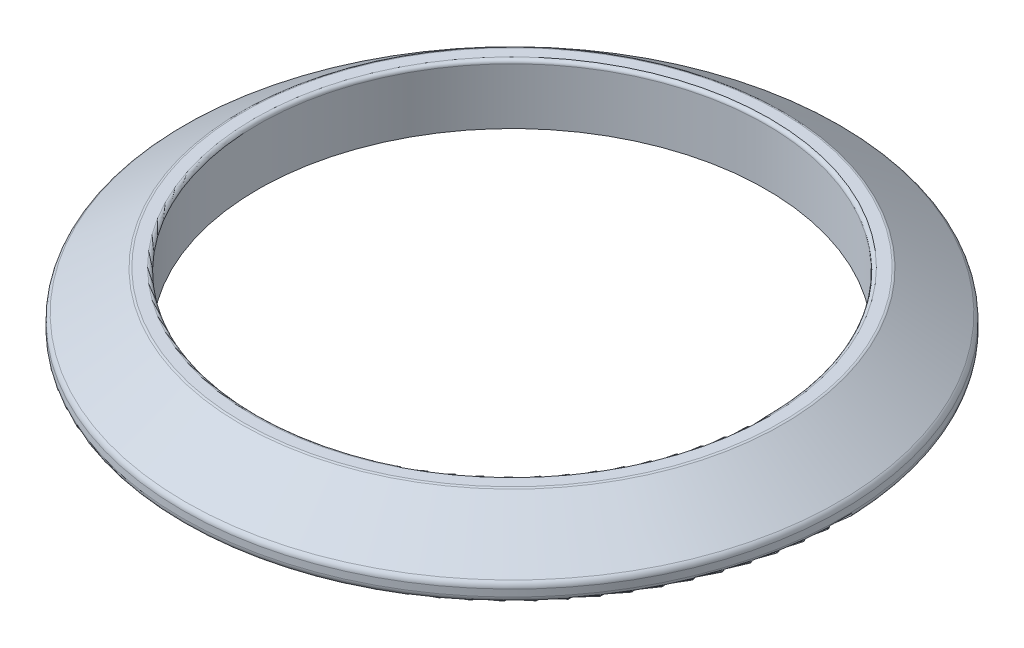
ISO-10303-21;
HEADER;
FILE_DESCRIPTION(('STEP AP214'),'2;1');
FILE_NAME('part.step','',(''),(''),'','','');
FILE_SCHEMA(('AUTOMOTIVE_DESIGN { 1 0 10303 214 1 1 1 1 }'));
ENDSEC;
DATA;
#1=APPLICATION_CONTEXT('core data for automotive mechanical design processes');
#2=APPLICATION_PROTOCOL_DEFINITION('international standard','automotive_design',2000,#1);
#3=PRODUCT_CONTEXT('',#1,'mechanical');
#4=PRODUCT('Part','Part','',(#3));
#5=PRODUCT_RELATED_PRODUCT_CATEGORY('part','',(#4));
#6=PRODUCT_DEFINITION_FORMATION('','',#4);
#7=PRODUCT_DEFINITION_CONTEXT('part definition',#1,'design');
#8=PRODUCT_DEFINITION('design','',#6,#7);
#9=PRODUCT_DEFINITION_SHAPE('','',#8);
#10=(LENGTH_UNIT() NAMED_UNIT(*) SI_UNIT(.MILLI.,.METRE.));
#11=(NAMED_UNIT(*) PLANE_ANGLE_UNIT() SI_UNIT($,.RADIAN.));
#12=(NAMED_UNIT(*) SI_UNIT($,.STERADIAN.) SOLID_ANGLE_UNIT());
#13=UNCERTAINTY_MEASURE_WITH_UNIT(LENGTH_MEASURE(1.E-05),#10,'distance_accuracy_value','');
#14=(GEOMETRIC_REPRESENTATION_CONTEXT(3) GLOBAL_UNCERTAINTY_ASSIGNED_CONTEXT((#13)) GLOBAL_UNIT_ASSIGNED_CONTEXT((#10,
#11,#12)) REPRESENTATION_CONTEXT('',''));
#15=CARTESIAN_POINT('',(0.,0.,0.));
#16=DIRECTION('',(0.,0.,1.));
#17=DIRECTION('',(1.,0.,0.));
#18=AXIS2_PLACEMENT_3D('',#15,#16,#17);
#19=CARTESIAN_POINT('',(0.,0.2,0.));
#20=DIRECTION('',(0.,1.,0.));
#21=DIRECTION('',(0.,0.,1.));
#22=AXIS2_PLACEMENT_3D('',#19,#20,#21);
#23=TOROIDAL_SURFACE('',#22,9.2,0.2);
#24=CARTESIAN_POINT('',(0.,0.2,0.));
#25=DIRECTION('',(0.,1.,0.));
#26=DIRECTION('',(0.,0.,1.));
#27=AXIS2_PLACEMENT_3D('',#24,#25,#26);
#28=CIRCLE('',#27,9.4);
#29=CARTESIAN_POINT('',(0.,0.2,9.4));
#30=VERTEX_POINT('',#29);
#31=EDGE_CURVE('E35',#30,#30,#28,.T.);
#32=ORIENTED_EDGE('',*,*,#31,.F.);
#33=EDGE_LOOP('',(#32));
#34=FACE_BOUND('',#33,.T.);
#35=CARTESIAN_POINT('',(0.,0.,0.));
#36=DIRECTION('',(0.,-1.,0.));
#37=DIRECTION('',(0.,0.,1.));
#38=AXIS2_PLACEMENT_3D('',#35,#36,#37);
#39=CIRCLE('',#38,9.2);
#40=CARTESIAN_POINT('',(0.,0.,9.2));
#41=VERTEX_POINT('',#40);
#42=EDGE_CURVE('E42',#41,#41,#39,.T.);
#43=ORIENTED_EDGE('',*,*,#42,.F.);
#44=EDGE_LOOP('',(#43));
#45=FACE_BOUND('',#44,.T.);
#46=ADVANCED_FACE('F15',(#34,#45),#23,.T.);
#47=CARTESIAN_POINT('',(0.,0.396368799450766,0.));
#48=DIRECTION('',(0.,1.,0.));
#49=DIRECTION('',(0.,0.,1.));
#50=AXIS2_PLACEMENT_3D('',#47,#48,#49);
#51=TOROIDAL_SURFACE('',#50,9.2,0.2);
#52=CARTESIAN_POINT('',(0.,0.559762372103719,0.));
#53=DIRECTION('',(0.,1.,0.));
#54=DIRECTION('',(0.,0.,-1.));
#55=AXIS2_PLACEMENT_3D('',#52,#53,#54);
#56=CIRCLE('',#55,9.31533663951974);
#57=CARTESIAN_POINT('',(0.,0.559762372103719,-9.31533663951974));
#58=VERTEX_POINT('',#57);
#59=EDGE_CURVE('E23',#58,#58,#56,.T.);
#60=ORIENTED_EDGE('',*,*,#59,.F.);
#61=EDGE_LOOP('',(#60));
#62=FACE_BOUND('',#61,.T.);
#63=CARTESIAN_POINT('',(0.,0.396368799450766,0.));
#64=DIRECTION('',(0.,-1.,0.));
#65=DIRECTION('',(0.,0.,1.));
#66=AXIS2_PLACEMENT_3D('',#63,#64,#65);
#67=CIRCLE('',#66,9.4);
#68=CARTESIAN_POINT('',(0.,0.396368799450766,9.4));
#69=VERTEX_POINT('',#68);
#70=EDGE_CURVE('E28',#69,#69,#67,.T.);
#71=ORIENTED_EDGE('',*,*,#70,.F.);
#72=EDGE_LOOP('',(#71));
#73=FACE_BOUND('',#72,.T.);
#74=ADVANCED_FACE('F53',(#62,#73),#51,.T.);
#75=CARTESIAN_POINT('',(0.,1.6,0.));
#76=DIRECTION('',(0.,1.,0.));
#77=DIRECTION('',(0.,0.,1.));
#78=AXIS2_PLACEMENT_3D('',#75,#76,#77);
#79=TOROIDAL_SURFACE('',#78,7.35,0.1);
#80=CARTESIAN_POINT('',(0.,1.6,0.));
#81=DIRECTION('',(0.,1.,0.));
#82=DIRECTION('',(0.,0.,1.));
#83=AXIS2_PLACEMENT_3D('',#80,#81,#82);
#84=CIRCLE('',#83,7.25);
#85=CARTESIAN_POINT('',(0.,1.6,7.25));
#86=VERTEX_POINT('',#85);
#87=EDGE_CURVE('E31',#86,#86,#84,.T.);
#88=ORIENTED_EDGE('',*,*,#87,.F.);
#89=EDGE_LOOP('',(#88));
#90=FACE_BOUND('',#89,.T.);
#91=CARTESIAN_POINT('',(0.,1.7,0.));
#92=DIRECTION('',(0.,-1.,0.));
#93=DIRECTION('',(0.,0.,1.));
#94=AXIS2_PLACEMENT_3D('',#91,#92,#93);
#95=CIRCLE('',#94,7.35);
#96=CARTESIAN_POINT('',(0.,1.7,7.35));
#97=VERTEX_POINT('',#96);
#98=EDGE_CURVE('E36',#97,#97,#95,.T.);
#99=ORIENTED_EDGE('',*,*,#98,.F.);
#100=EDGE_LOOP('',(#99));
#101=FACE_BOUND('',#100,.T.);
#102=ADVANCED_FACE('F55',(#90,#101),#79,.T.);
#103=CARTESIAN_POINT('',(0.,1.6,0.));
#104=DIRECTION('',(0.,1.,0.));
#105=DIRECTION('',(0.,0.,1.));
#106=AXIS2_PLACEMENT_3D('',#103,#104,#105);
#107=TOROIDAL_SURFACE('',#106,7.66826123294429,0.1);
#108=CARTESIAN_POINT('',(0.,1.7,0.));
#109=DIRECTION('',(0.,1.,0.));
#110=DIRECTION('',(0.,0.,1.));
#111=AXIS2_PLACEMENT_3D('',#108,#109,#110);
#112=CIRCLE('',#111,7.66826123294429);
#113=CARTESIAN_POINT('',(0.,1.7,7.66826123294429));
#114=VERTEX_POINT('',#113);
#115=EDGE_CURVE('E33',#114,#114,#112,.T.);
#116=ORIENTED_EDGE('',*,*,#115,.F.);
#117=EDGE_LOOP('',(#116));
#118=FACE_BOUND('',#117,.T.);
#119=CARTESIAN_POINT('',(0.,1.68169678632648,0.));
#120=DIRECTION('',(0.,-1.,0.));
#121=DIRECTION('',(0.,0.,1.));
#122=AXIS2_PLACEMENT_3D('',#119,#120,#121);
#123=CIRCLE('',#122,7.72592955270415);
#124=CARTESIAN_POINT('',(0.,1.68169678632648,7.72592955270415));
#125=VERTEX_POINT('',#124);
#126=EDGE_CURVE('E10',#125,#125,#123,.T.);
#127=ORIENTED_EDGE('',*,*,#126,.F.);
#128=EDGE_LOOP('',(#127));
#129=FACE_BOUND('',#128,.T.);
#130=ADVANCED_FACE('F63',(#118,#129),#107,.T.);
#131=CARTESIAN_POINT('',(0.,0.,0.));
#132=DIRECTION('',(0.,1.,0.));
#133=DIRECTION('',(0.,0.,1.));
#134=AXIS2_PLACEMENT_3D('',#131,#132,#133);
#135=CYLINDRICAL_SURFACE('',#134,7.25);
#136=ORIENTED_EDGE('',*,*,#87,.T.);
#137=EDGE_LOOP('',(#136));
#138=FACE_BOUND('',#137,.T.);
#139=CARTESIAN_POINT('',(0.,0.,0.));
#140=DIRECTION('',(0.,1.,0.));
#141=DIRECTION('',(0.,0.,1.));
#142=AXIS2_PLACEMENT_3D('',#139,#140,#141);
#143=CIRCLE('',#142,7.25);
#144=CARTESIAN_POINT('',(0.,0.,7.25));
#145=VERTEX_POINT('',#144);
#146=EDGE_CURVE('E19',#145,#145,#143,.T.);
#147=ORIENTED_EDGE('',*,*,#146,.F.);
#148=EDGE_LOOP('',(#147));
#149=FACE_BOUND('',#148,.T.);
#150=ADVANCED_FACE('F72',(#138,#149),#135,.F.);
#151=CARTESIAN_POINT('',(0.,1.7,0.));
#152=DIRECTION('',(0.,-1.,0.));
#153=DIRECTION('',(0.,0.,-1.));
#154=AXIS2_PLACEMENT_3D('',#151,#152,#153);
#155=CONICAL_SURFACE('',#154,7.69999999999999,0.956133374872733);
#156=ORIENTED_EDGE('',*,*,#59,.T.);
#157=EDGE_LOOP('',(#156));
#158=FACE_BOUND('',#157,.T.);
#159=ORIENTED_EDGE('',*,*,#126,.T.);
#160=EDGE_LOOP('',(#159));
#161=FACE_BOUND('',#160,.T.);
#162=ADVANCED_FACE('F76',(#158,#161),#155,.T.);
#163=CARTESIAN_POINT('',(0.,1.7,0.));
#164=DIRECTION('',(0.,-1.,0.));
#165=DIRECTION('',(0.,0.,-1.));
#166=AXIS2_PLACEMENT_3D('',#163,#164,#165);
#167=CYLINDRICAL_SURFACE('',#166,9.4);
#168=ORIENTED_EDGE('',*,*,#31,.T.);
#169=EDGE_LOOP('',(#168));
#170=FACE_BOUND('',#169,.T.);
#171=ORIENTED_EDGE('',*,*,#70,.T.);
#172=EDGE_LOOP('',(#171));
#173=FACE_BOUND('',#172,.T.);
#174=ADVANCED_FACE('F51',(#170,#173),#167,.T.);
#175=CARTESIAN_POINT('',(0.,1.7,0.));
#176=DIRECTION('',(0.,1.,0.));
#177=DIRECTION('',(0.,0.,1.));
#178=AXIS2_PLACEMENT_3D('',#175,#176,#177);
#179=PLANE('',#178);
#180=ORIENTED_EDGE('',*,*,#115,.T.);
#181=EDGE_LOOP('',(#180));
#182=FACE_BOUND('',#181,.T.);
#183=ORIENTED_EDGE('',*,*,#98,.T.);
#184=EDGE_LOOP('',(#183));
#185=FACE_BOUND('',#184,.T.);
#186=ADVANCED_FACE('F82',(#182,#185),#179,.T.);
#187=CARTESIAN_POINT('',(0.,0.,0.));
#188=DIRECTION('',(0.,1.,0.));
#189=DIRECTION('',(0.,0.,1.));
#190=AXIS2_PLACEMENT_3D('',#187,#188,#189);
#191=PLANE('',#190);
#192=ORIENTED_EDGE('',*,*,#42,.T.);
#193=EDGE_LOOP('',(#192));
#194=FACE_BOUND('',#193,.T.);
#195=ORIENTED_EDGE('',*,*,#146,.T.);
#196=EDGE_LOOP('',(#195));
#197=FACE_BOUND('',#196,.T.);
#198=ADVANCED_FACE('F17',(#194,#197),#191,.F.);
#199=CLOSED_SHELL('',(#46,#74,#102,#130,#150,#162,#174,#186,#198));
#200=MANIFOLD_SOLID_BREP('B1',#199);
#201=ADVANCED_BREP_SHAPE_REPRESENTATION('',(#18,#200),#14);
#202=SHAPE_DEFINITION_REPRESENTATION(#9,#201);
ENDSEC;
END-ISO-10303-21;
